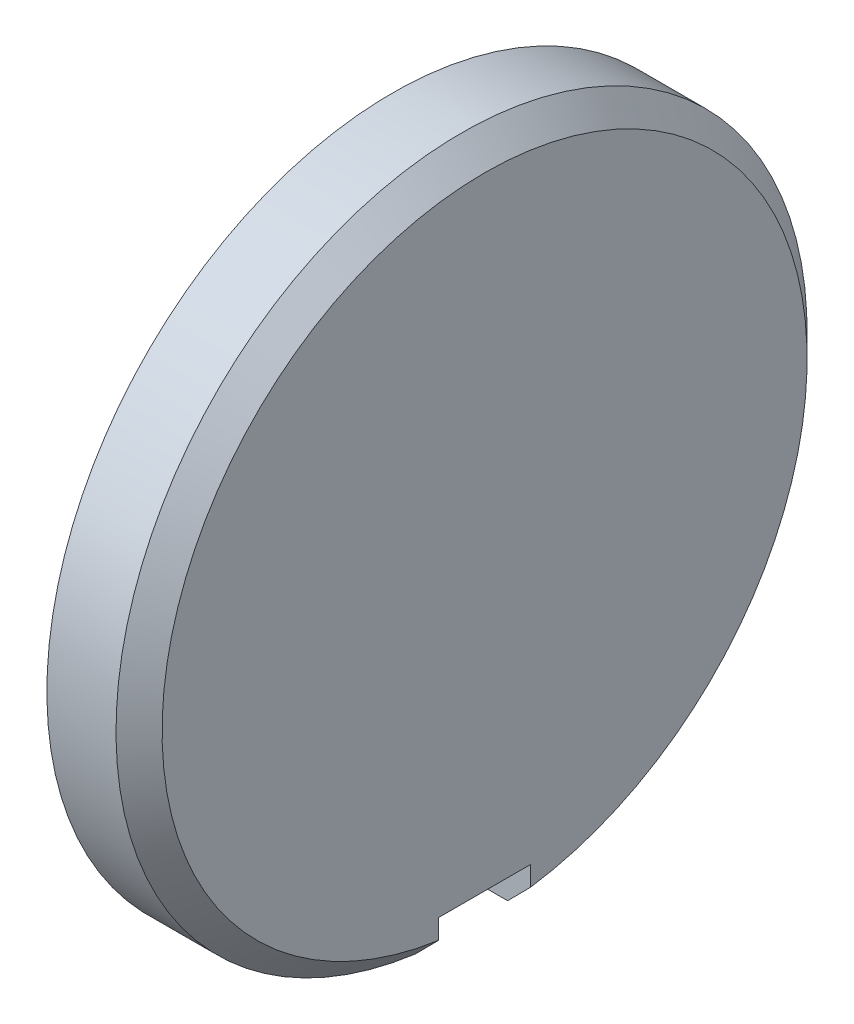
ISO-10303-21;
HEADER;
FILE_DESCRIPTION(('STEP AP214'),'2;1');
FILE_NAME('part.step','',(''),(''),'','','');
FILE_SCHEMA(('AUTOMOTIVE_DESIGN { 1 0 10303 214 1 1 1 1 }'));
ENDSEC;
DATA;
#1=APPLICATION_CONTEXT('core data for automotive mechanical design processes');
#2=APPLICATION_PROTOCOL_DEFINITION('international standard','automotive_design',2000,#1);
#3=PRODUCT_CONTEXT('',#1,'mechanical');
#4=PRODUCT('Part','Part','',(#3));
#5=PRODUCT_RELATED_PRODUCT_CATEGORY('part','',(#4));
#6=PRODUCT_DEFINITION_FORMATION('','',#4);
#7=PRODUCT_DEFINITION_CONTEXT('part definition',#1,'design');
#8=PRODUCT_DEFINITION('design','',#6,#7);
#9=PRODUCT_DEFINITION_SHAPE('','',#8);
#10=(LENGTH_UNIT() NAMED_UNIT(*) SI_UNIT(.MILLI.,.METRE.));
#11=(NAMED_UNIT(*) PLANE_ANGLE_UNIT() SI_UNIT($,.RADIAN.));
#12=(NAMED_UNIT(*) SI_UNIT($,.STERADIAN.) SOLID_ANGLE_UNIT());
#13=UNCERTAINTY_MEASURE_WITH_UNIT(LENGTH_MEASURE(1.E-05),#10,'distance_accuracy_value','');
#14=(GEOMETRIC_REPRESENTATION_CONTEXT(3) GLOBAL_UNCERTAINTY_ASSIGNED_CONTEXT((#13)) GLOBAL_UNIT_ASSIGNED_CONTEXT((#10,
#11,#12)) REPRESENTATION_CONTEXT('',''));
#15=CARTESIAN_POINT('',(0.,0.,0.));
#16=DIRECTION('',(0.,0.,1.));
#17=DIRECTION('',(1.,0.,0.));
#18=AXIS2_PLACEMENT_3D('',#15,#16,#17);
#19=CARTESIAN_POINT('',(61.,18.,-52.));
#20=DIRECTION('',(-1.,0.,0.));
#21=DIRECTION('',(0.,0.,1.));
#22=AXIS2_PLACEMENT_3D('',#19,#20,#21);
#23=PLANE('',#22);
#24=DIRECTION('',(0.,-1.,0.));
#25=VECTOR('',#24,1.);
#26=CARTESIAN_POINT('',(61.,18.,-51.2));
#27=LINE('',#26,#25);
#28=CARTESIAN_POINT('',(61.,12.8,-51.2));
#29=VERTEX_POINT('',#28);
#30=CARTESIAN_POINT('',(61.,12.4574374157796,-51.2));
#31=VERTEX_POINT('',#30);
#32=EDGE_CURVE('E210',#29,#31,#27,.T.);
#33=ORIENTED_EDGE('',*,*,#32,.F.);
#34=DIRECTION('',(0.,0.,1.));
#35=VECTOR('',#34,1.);
#36=CARTESIAN_POINT('',(61.,12.8,-52.));
#37=LINE('',#36,#35);
#38=CARTESIAN_POINT('',(61.,12.8,-52.8));
#39=VERTEX_POINT('',#38);
#40=EDGE_CURVE('E202',#39,#29,#37,.T.);
#41=ORIENTED_EDGE('',*,*,#40,.F.);
#42=DIRECTION('',(0.,-1.,0.));
#43=VECTOR('',#42,1.);
#44=CARTESIAN_POINT('',(61.,18.,-52.8));
#45=LINE('',#44,#43);
#46=CARTESIAN_POINT('',(61.,12.4574374157796,-52.8));
#47=VERTEX_POINT('',#46);
#48=EDGE_CURVE('E188',#39,#47,#45,.T.);
#49=ORIENTED_EDGE('',*,*,#48,.T.);
#50=CARTESIAN_POINT('',(61.,18.,-52.));
#51=DIRECTION('',(-1.,0.,0.));
#52=DIRECTION('',(0.,0.,1.));
#53=AXIS2_PLACEMENT_3D('',#50,#51,#52);
#54=CIRCLE('',#53,5.6);
#55=EDGE_CURVE('E315',#31,#47,#54,.T.);
#56=ORIENTED_EDGE('',*,*,#55,.F.);
#57=EDGE_LOOP('',(#33,#41,#49,#56));
#58=FACE_BOUND('',#57,.T.);
#59=ADVANCED_FACE('F47',(#58),#23,.F.);
#60=CARTESIAN_POINT('',(61.,18.,-52.));
#61=DIRECTION('',(-1.,0.,0.));
#62=DIRECTION('',(0.,0.,1.));
#63=AXIS2_PLACEMENT_3D('',#60,#61,#62);
#64=CONICAL_SURFACE('',#63,5.6,0.785398163397448);
#65=CARTESIAN_POINT('',(61.8946271909999,13.3631332484449,-51.2));
#66=CARTESIAN_POINT('',(61.7126166868986,13.1784446629332,-51.2));
#67=CARTESIAN_POINT('',(61.5304582431577,12.9939020574378,-51.2));
#68=CARTESIAN_POINT('',(61.1659108831408,12.625044935687,-51.2));
#69=CARTESIAN_POINT('',(60.9835219670776,12.4407304192213,-51.2));
#70=CARTESIAN_POINT('',(60.6185788185969,12.0722653505341,-51.2));
#71=CARTESIAN_POINT('',(60.4360245862569,11.8881147982359,-51.2));
#72=CARTESIAN_POINT('',(60.0707866928955,11.5199417495671,-51.2));
#73=CARTESIAN_POINT('',(59.8881030317565,11.3359192533132,-51.2));
#74=CARTESIAN_POINT('',(59.7053728090001,11.151943041791,-51.2));
#75=B_SPLINE_CURVE_WITH_KNOTS('',3,(#65,#66,#67,#68,#69,#70,#71,#72,#73,#74),.UNSPECIFIED.,.F.,
.F.,(4,2,2,2,4),(0.,0.777906711944208,1.5558127061892,2.3337183358319,3.11162467374071),.UNSPECIFIED.);
#76=CARTESIAN_POINT('',(60.6,12.0535725010726,-51.2));
#77=VERTEX_POINT('',#76);
#78=EDGE_CURVE('E217',#31,#77,#75,.T.);
#79=ORIENTED_EDGE('',*,*,#78,.F.);
#80=ORIENTED_EDGE('',*,*,#55,.T.);
#81=CARTESIAN_POINT('',(61.8946271909999,13.3631332484449,-52.8));
#82=CARTESIAN_POINT('',(61.7126166868986,13.1784446629332,-52.8));
#83=CARTESIAN_POINT('',(61.5304582431577,12.9939020574378,-52.8));
#84=CARTESIAN_POINT('',(61.1659108831408,12.625044935687,-52.8));
#85=CARTESIAN_POINT('',(60.9835219670776,12.4407304192213,-52.8));
#86=CARTESIAN_POINT('',(60.6185788185969,12.0722653505341,-52.8));
#87=CARTESIAN_POINT('',(60.4360245862569,11.8881147982359,-52.8));
#88=CARTESIAN_POINT('',(60.0707866928955,11.5199417495671,-52.8));
#89=CARTESIAN_POINT('',(59.8881030317565,11.3359192533132,-52.8));
#90=CARTESIAN_POINT('',(59.7053728090001,11.151943041791,-52.8));
#91=B_SPLINE_CURVE_WITH_KNOTS('',3,(#81,#82,#83,#84,#85,#86,#87,#88,#89,#90),.UNSPECIFIED.,.F.,
.F.,(4,2,2,2,4),(0.,0.777906711944208,1.5558127061892,2.3337183358319,3.11162467374071),.UNSPECIFIED.);
#92=CARTESIAN_POINT('',(60.6,12.0535725010726,-52.8));
#93=VERTEX_POINT('',#92);
#94=EDGE_CURVE('E191',#47,#93,#91,.T.);
#95=ORIENTED_EDGE('',*,*,#94,.T.);
#96=CARTESIAN_POINT('',(60.6,18.,-52.));
#97=DIRECTION('',(-1.,0.,0.));
#98=DIRECTION('',(0.,0.,1.));
#99=AXIS2_PLACEMENT_3D('',#96,#97,#98);
#100=CIRCLE('',#99,6.);
#101=EDGE_CURVE('E311',#77,#93,#100,.T.);
#102=ORIENTED_EDGE('',*,*,#101,.F.);
#103=EDGE_LOOP('',(#79,#80,#95,#102));
#104=FACE_BOUND('',#103,.T.);
#105=ADVANCED_FACE('F470',(#104),#64,.T.);
#106=CARTESIAN_POINT('',(53.2,18.,-52.));
#107=DIRECTION('',(-1.,0.,0.));
#108=DIRECTION('',(0.,0.,1.));
#109=AXIS2_PLACEMENT_3D('',#106,#107,#108);
#110=CYLINDRICAL_SURFACE('',#109,6.);
#111=DIRECTION('',(-1.,0.,0.));
#112=VECTOR('',#111,1.);
#113=CARTESIAN_POINT('',(53.2,12.0535725010726,-51.2));
#114=LINE('',#113,#112);
#115=CARTESIAN_POINT('',(59.4,12.0535725010726,-51.2));
#116=VERTEX_POINT('',#115);
#117=EDGE_CURVE('E197',#77,#116,#114,.T.);
#118=ORIENTED_EDGE('',*,*,#117,.F.);
#119=ORIENTED_EDGE('',*,*,#101,.T.);
#120=DIRECTION('',(-1.,0.,0.));
#121=VECTOR('',#120,1.);
#122=CARTESIAN_POINT('',(53.2,12.0535725010726,-52.8));
#123=LINE('',#122,#121);
#124=CARTESIAN_POINT('',(59.4,12.0535725010726,-52.8));
#125=VERTEX_POINT('',#124);
#126=EDGE_CURVE('E679',#93,#125,#123,.T.);
#127=ORIENTED_EDGE('',*,*,#126,.T.);
#128=CARTESIAN_POINT('',(59.4,18.,-52.));
#129=DIRECTION('',(-1.,0.,0.));
#130=DIRECTION('',(0.,0.,1.));
#131=AXIS2_PLACEMENT_3D('',#128,#129,#130);
#132=CIRCLE('',#131,6.);
#133=EDGE_CURVE('E307',#116,#125,#132,.T.);
#134=ORIENTED_EDGE('',*,*,#133,.F.);
#135=EDGE_LOOP('',(#118,#119,#127,#134));
#136=FACE_BOUND('',#135,.T.);
#137=ADVANCED_FACE('F475',(#136),#110,.T.);
#138=CARTESIAN_POINT('',(59.4,24.,-52.));
#139=DIRECTION('',(1.,0.,0.));
#140=DIRECTION('',(0.,0.,-1.));
#141=AXIS2_PLACEMENT_3D('',#138,#139,#140);
#142=PLANE('',#141);
#143=CARTESIAN_POINT('',(59.4,18.,-52.));
#144=DIRECTION('',(-1.,0.,0.));
#145=DIRECTION('',(0.,0.,1.));
#146=AXIS2_PLACEMENT_3D('',#143,#144,#145);
#147=CIRCLE('',#146,3.);
#148=CARTESIAN_POINT('',(59.4,18.,-49.));
#149=VERTEX_POINT('',#148);
#150=EDGE_CURVE('E301',#149,#149,#147,.T.);
#151=ORIENTED_EDGE('',*,*,#150,.F.);
#152=EDGE_LOOP('',(#151));
#153=FACE_BOUND('',#152,.T.);
#154=DIRECTION('',(0.,1.,0.));
#155=VECTOR('',#154,1.);
#156=CARTESIAN_POINT('',(59.4,24.,-51.2));
#157=LINE('',#156,#155);
#158=CARTESIAN_POINT('',(59.4,12.8,-51.2));
#159=VERTEX_POINT('',#158);
#160=EDGE_CURVE('E11',#116,#159,#157,.T.);
#161=ORIENTED_EDGE('',*,*,#160,.F.);
#162=ORIENTED_EDGE('',*,*,#133,.T.);
#163=DIRECTION('',(0.,1.,0.));
#164=VECTOR('',#163,1.);
#165=CARTESIAN_POINT('',(59.4,24.,-52.8));
#166=LINE('',#165,#164);
#167=CARTESIAN_POINT('',(59.4,12.8,-52.8));
#168=VERTEX_POINT('',#167);
#169=EDGE_CURVE('E363',#125,#168,#166,.T.);
#170=ORIENTED_EDGE('',*,*,#169,.T.);
#171=DIRECTION('',(0.,0.,-1.));
#172=VECTOR('',#171,1.);
#173=CARTESIAN_POINT('',(59.4,12.8,-52.));
#174=LINE('',#173,#172);
#175=EDGE_CURVE('E56',#159,#168,#174,.T.);
#176=ORIENTED_EDGE('',*,*,#175,.F.);
#177=EDGE_LOOP('',(#161,#162,#170,#176));
#178=FACE_BOUND('',#177,.T.);
#179=ADVANCED_FACE('F498',(#153,#178),#142,.F.);
#180=CARTESIAN_POINT('',(58.2,21.,-52.));
#181=DIRECTION('',(1.,0.,0.));
#182=DIRECTION('',(0.,0.,-1.));
#183=AXIS2_PLACEMENT_3D('',#180,#181,#182);
#184=PLANE('',#183);
#185=DIRECTION('',(0.,1.,0.));
#186=VECTOR('',#185,1.);
#187=CARTESIAN_POINT('',(58.2,21.,-51.6));
#188=LINE('',#187,#186);
#189=CARTESIAN_POINT('',(58.2,15.0267862505363,-51.6));
#190=VERTEX_POINT('',#189);
#191=CARTESIAN_POINT('',(58.2,15.7350496694188,-51.6));
#192=VERTEX_POINT('',#191);
#193=EDGE_CURVE('E248',#190,#192,#188,.T.);
#194=ORIENTED_EDGE('',*,*,#193,.F.);
#195=CARTESIAN_POINT('',(58.2,18.,-52.));
#196=DIRECTION('',(-1.,0.,0.));
#197=DIRECTION('',(0.,0.,1.));
#198=AXIS2_PLACEMENT_3D('',#195,#196,#197);
#199=CIRCLE('',#198,3.);
#200=CARTESIAN_POINT('',(58.2,17.6,-49.0267862505363));
#201=VERTEX_POINT('',#200);
#202=EDGE_CURVE('E296',#190,#201,#199,.T.);
#203=ORIENTED_EDGE('',*,*,#202,.T.);
#204=DIRECTION('',(0.,0.,1.));
#205=VECTOR('',#204,1.);
#206=CARTESIAN_POINT('',(58.2,17.6,-52.));
#207=LINE('',#206,#205);
#208=CARTESIAN_POINT('',(58.2,17.6,-49.7350496694188));
#209=VERTEX_POINT('',#208);
#210=EDGE_CURVE('E284',#209,#201,#207,.T.);
#211=ORIENTED_EDGE('',*,*,#210,.F.);
#212=CARTESIAN_POINT('',(58.2,18.,-52.));
#213=DIRECTION('',(-1.,0.,0.));
#214=DIRECTION('',(0.,0.,1.));
#215=AXIS2_PLACEMENT_3D('',#212,#213,#214);
#216=CIRCLE('',#215,2.3);
#217=EDGE_CURVE('E322',#192,#209,#216,.T.);
#218=ORIENTED_EDGE('',*,*,#217,.F.);
#219=EDGE_LOOP('',(#194,#203,#211,#218));
#220=FACE_BOUND('',#219,.T.);
#221=ADVANCED_FACE('F418',(#220),#184,.F.);
#222=DIRECTION('',(0.,1.,0.));
#223=VECTOR('',#222,1.);
#224=CARTESIAN_POINT('',(58.2,21.,-51.6));
#225=LINE('',#224,#223);
#226=CARTESIAN_POINT('',(58.2,20.2649503305812,-51.6));
#227=VERTEX_POINT('',#226);
#228=CARTESIAN_POINT('',(58.2,20.9732137494637,-51.6));
#229=VERTEX_POINT('',#228);
#230=EDGE_CURVE('E242',#227,#229,#225,.T.);
#231=ORIENTED_EDGE('',*,*,#230,.F.);
#232=CARTESIAN_POINT('',(58.2,18.4,-49.7350496694188));
#233=VERTEX_POINT('',#232);
#234=EDGE_CURVE('E323',#233,#227,#216,.T.);
#235=ORIENTED_EDGE('',*,*,#234,.F.);
#236=DIRECTION('',(0.,0.,-1.));
#237=VECTOR('',#236,1.);
#238=CARTESIAN_POINT('',(58.2,18.4,-52.));
#239=LINE('',#238,#237);
#240=CARTESIAN_POINT('',(58.2,18.4,-49.0267862505363));
#241=VERTEX_POINT('',#240);
#242=EDGE_CURVE('E273',#241,#233,#239,.T.);
#243=ORIENTED_EDGE('',*,*,#242,.F.);
#244=EDGE_CURVE('E297',#241,#229,#199,.T.);
#245=ORIENTED_EDGE('',*,*,#244,.T.);
#246=EDGE_LOOP('',(#231,#235,#243,#245));
#247=FACE_BOUND('',#246,.T.);
#248=ADVANCED_FACE('F436',(#247),#184,.F.);
#249=CARTESIAN_POINT('',(53.2,18.,-52.));
#250=DIRECTION('',(-1.,0.,0.));
#251=DIRECTION('',(0.,0.,1.));
#252=AXIS2_PLACEMENT_3D('',#249,#250,#251);
#253=CYLINDRICAL_SURFACE('',#252,2.3);
#254=CARTESIAN_POINT('',(59.4,18.,-52.));
#255=DIRECTION('',(-1.,0.,0.));
#256=DIRECTION('',(0.,0.,1.));
#257=AXIS2_PLACEMENT_3D('',#254,#255,#256);
#258=CIRCLE('',#257,2.3);
#259=CARTESIAN_POINT('',(59.4,18.,-49.7));
#260=VERTEX_POINT('',#259);
#261=EDGE_CURVE('E318',#260,#260,#258,.T.);
#262=ORIENTED_EDGE('',*,*,#261,.F.);
#263=EDGE_LOOP('',(#262));
#264=FACE_BOUND('',#263,.T.);
#265=DIRECTION('',(-1.,0.,0.));
#266=VECTOR('',#265,1.);
#267=CARTESIAN_POINT('',(53.2,15.7350496694188,-51.6));
#268=LINE('',#267,#266);
#269=CARTESIAN_POINT('',(59.38,15.7350496694188,-51.6));
#270=VERTEX_POINT('',#269);
#271=EDGE_CURVE('E251',#192,#270,#268,.F.);
#272=ORIENTED_EDGE('',*,*,#271,.F.);
#273=ORIENTED_EDGE('',*,*,#217,.T.);
#274=DIRECTION('',(-1.,0.,0.));
#275=VECTOR('',#274,1.);
#276=CARTESIAN_POINT('',(53.2,17.6,-49.7350496694188));
#277=LINE('',#276,#275);
#278=CARTESIAN_POINT('',(59.38,17.6,-49.7350496694188));
#279=VERTEX_POINT('',#278);
#280=EDGE_CURVE('E288',#279,#209,#277,.T.);
#281=ORIENTED_EDGE('',*,*,#280,.F.);
#282=CARTESIAN_POINT('',(59.38,18.,-52.));
#283=DIRECTION('',(-1.,0.,0.));
#284=DIRECTION('',(0.,0.,1.));
#285=AXIS2_PLACEMENT_3D('',#282,#283,#284);
#286=CIRCLE('',#285,2.3);
#287=CARTESIAN_POINT('',(59.38,18.4,-49.7350496694188));
#288=VERTEX_POINT('',#287);
#289=EDGE_CURVE('E280',#288,#279,#286,.F.);
#290=ORIENTED_EDGE('',*,*,#289,.F.);
#291=DIRECTION('',(-1.,0.,0.));
#292=VECTOR('',#291,1.);
#293=CARTESIAN_POINT('',(53.2,18.4,-49.7350496694188));
#294=LINE('',#293,#292);
#295=EDGE_CURVE('E277',#233,#288,#294,.F.);
#296=ORIENTED_EDGE('',*,*,#295,.F.);
#297=ORIENTED_EDGE('',*,*,#234,.T.);
#298=DIRECTION('',(-1.,0.,0.));
#299=VECTOR('',#298,1.);
#300=CARTESIAN_POINT('',(53.2,20.2649503305812,-51.6));
#301=LINE('',#300,#299);
#302=CARTESIAN_POINT('',(59.38,20.2649503305812,-51.6));
#303=VERTEX_POINT('',#302);
#304=EDGE_CURVE('E245',#303,#227,#301,.T.);
#305=ORIENTED_EDGE('',*,*,#304,.F.);
#306=CARTESIAN_POINT('',(59.38,18.,-52.));
#307=DIRECTION('',(-1.,0.,0.));
#308=DIRECTION('',(0.,0.,1.));
#309=AXIS2_PLACEMENT_3D('',#306,#307,#308);
#310=CIRCLE('',#309,2.3);
#311=CARTESIAN_POINT('',(59.38,20.2649503305812,-52.4));
#312=VERTEX_POINT('',#311);
#313=EDGE_CURVE('E254',#312,#303,#310,.F.);
#314=ORIENTED_EDGE('',*,*,#313,.F.);
#315=DIRECTION('',(-1.,0.,0.));
#316=VECTOR('',#315,1.);
#317=CARTESIAN_POINT('',(53.2,20.2649503305812,-52.4));
#318=LINE('',#317,#316);
#319=CARTESIAN_POINT('',(58.2,20.2649503305812,-52.4));
#320=VERTEX_POINT('',#319);
#321=EDGE_CURVE('E230',#312,#320,#318,.T.);
#322=ORIENTED_EDGE('',*,*,#321,.T.);
#323=CARTESIAN_POINT('',(58.2,18.4,-54.2649503305812));
#324=VERTEX_POINT('',#323);
#325=EDGE_CURVE('E328',#320,#324,#216,.T.);
#326=ORIENTED_EDGE('',*,*,#325,.T.);
#327=DIRECTION('',(-1.,0.,0.));
#328=VECTOR('',#327,1.);
#329=CARTESIAN_POINT('',(53.2,18.4,-54.2649503305812));
#330=LINE('',#329,#328);
#331=CARTESIAN_POINT('',(59.38,18.4,-54.2649503305812));
#332=VERTEX_POINT('',#331);
#333=EDGE_CURVE('E272',#332,#324,#330,.T.);
#334=ORIENTED_EDGE('',*,*,#333,.F.);
#335=CARTESIAN_POINT('',(59.38,17.6,-54.2649503305812));
#336=VERTEX_POINT('',#335);
#337=EDGE_CURVE('E283',#336,#332,#286,.F.);
#338=ORIENTED_EDGE('',*,*,#337,.F.);
#339=DIRECTION('',(-1.,0.,0.));
#340=VECTOR('',#339,1.);
#341=CARTESIAN_POINT('',(53.2,17.6,-54.2649503305812));
#342=LINE('',#341,#340);
#343=CARTESIAN_POINT('',(58.2,17.6,-54.2649503305812));
#344=VERTEX_POINT('',#343);
#345=EDGE_CURVE('E293',#344,#336,#342,.F.);
#346=ORIENTED_EDGE('',*,*,#345,.F.);
#347=CARTESIAN_POINT('',(58.2,15.7350496694188,-52.4));
#348=VERTEX_POINT('',#347);
#349=EDGE_CURVE('E329',#344,#348,#216,.T.);
#350=ORIENTED_EDGE('',*,*,#349,.T.);
#351=DIRECTION('',(-1.,0.,0.));
#352=VECTOR('',#351,1.);
#353=CARTESIAN_POINT('',(53.2,15.7350496694188,-52.4));
#354=LINE('',#353,#352);
#355=CARTESIAN_POINT('',(59.38,15.7350496694188,-52.4));
#356=VERTEX_POINT('',#355);
#357=EDGE_CURVE('E238',#348,#356,#354,.F.);
#358=ORIENTED_EDGE('',*,*,#357,.T.);
#359=EDGE_CURVE('E257',#270,#356,#310,.F.);
#360=ORIENTED_EDGE('',*,*,#359,.F.);
#361=EDGE_LOOP('',(#272,#273,#281,#290,#296,#297,#305,#314,#322,#326,#334,#338,#346,#350,#358,#360));
#362=FACE_BOUND('',#361,.T.);
#363=ADVANCED_FACE('F397',(#264,#362),#253,.F.);
#364=CARTESIAN_POINT('',(53.2,18.,-52.));
#365=DIRECTION('',(-1.,0.,0.));
#366=DIRECTION('',(0.,0.,1.));
#367=AXIS2_PLACEMENT_3D('',#364,#365,#366);
#368=CYLINDRICAL_SURFACE('',#367,3.);
#369=ORIENTED_EDGE('',*,*,#150,.T.);
#370=EDGE_LOOP('',(#369));
#371=FACE_BOUND('',#370,.T.);
#372=DIRECTION('',(-1.,0.,0.));
#373=VECTOR('',#372,1.);
#374=CARTESIAN_POINT('',(53.2,15.0267862505363,-51.6));
#375=LINE('',#374,#373);
#376=CARTESIAN_POINT('',(59.38,15.0267862505363,-51.6));
#377=VERTEX_POINT('',#376);
#378=EDGE_CURVE('E360',#377,#190,#375,.T.);
#379=ORIENTED_EDGE('',*,*,#378,.F.);
#380=CARTESIAN_POINT('',(59.38,18.,-52.));
#381=DIRECTION('',(-1.,0.,0.));
#382=DIRECTION('',(0.,0.,1.));
#383=AXIS2_PLACEMENT_3D('',#380,#381,#382);
#384=CIRCLE('',#383,3.);
#385=CARTESIAN_POINT('',(59.38,15.0267862505363,-52.4));
#386=VERTEX_POINT('',#385);
#387=EDGE_CURVE('E353',#386,#377,#384,.T.);
#388=ORIENTED_EDGE('',*,*,#387,.F.);
#389=DIRECTION('',(-1.,0.,0.));
#390=VECTOR('',#389,1.);
#391=CARTESIAN_POINT('',(53.2,15.0267862505363,-52.4));
#392=LINE('',#391,#390);
#393=CARTESIAN_POINT('',(58.2,15.0267862505363,-52.4));
#394=VERTEX_POINT('',#393);
#395=EDGE_CURVE('E356',#386,#394,#392,.T.);
#396=ORIENTED_EDGE('',*,*,#395,.T.);
#397=CARTESIAN_POINT('',(58.2,17.6,-54.9732137494637));
#398=VERTEX_POINT('',#397);
#399=EDGE_CURVE('E303',#398,#394,#199,.T.);
#400=ORIENTED_EDGE('',*,*,#399,.F.);
#401=DIRECTION('',(-1.,0.,0.));
#402=VECTOR('',#401,1.);
#403=CARTESIAN_POINT('',(53.2,17.6,-54.9732137494637));
#404=LINE('',#403,#402);
#405=CARTESIAN_POINT('',(59.38,17.6,-54.9732137494637));
#406=VERTEX_POINT('',#405);
#407=EDGE_CURVE('E335',#406,#398,#404,.T.);
#408=ORIENTED_EDGE('',*,*,#407,.F.);
#409=CARTESIAN_POINT('',(59.38,18.,-52.));
#410=DIRECTION('',(-1.,0.,0.));
#411=DIRECTION('',(0.,0.,1.));
#412=AXIS2_PLACEMENT_3D('',#409,#410,#411);
#413=CIRCLE('',#412,3.);
#414=CARTESIAN_POINT('',(59.38,18.4,-54.9732137494637));
#415=VERTEX_POINT('',#414);
#416=EDGE_CURVE('E332',#415,#406,#413,.T.);
#417=ORIENTED_EDGE('',*,*,#416,.F.);
#418=DIRECTION('',(-1.,0.,0.));
#419=VECTOR('',#418,1.);
#420=CARTESIAN_POINT('',(53.2,18.4,-54.9732137494637));
#421=LINE('',#420,#419);
#422=CARTESIAN_POINT('',(58.2,18.4,-54.9732137494637));
#423=VERTEX_POINT('',#422);
#424=EDGE_CURVE('E327',#423,#415,#421,.F.);
#425=ORIENTED_EDGE('',*,*,#424,.F.);
#426=CARTESIAN_POINT('',(58.2,20.9732137494637,-52.4));
#427=VERTEX_POINT('',#426);
#428=EDGE_CURVE('E302',#427,#423,#199,.T.);
#429=ORIENTED_EDGE('',*,*,#428,.F.);
#430=DIRECTION('',(-1.,0.,0.));
#431=VECTOR('',#430,1.);
#432=CARTESIAN_POINT('',(53.2,20.9732137494637,-52.4));
#433=LINE('',#432,#431);
#434=CARTESIAN_POINT('',(59.38,20.9732137494637,-52.4));
#435=VERTEX_POINT('',#434);
#436=EDGE_CURVE('E345',#427,#435,#433,.F.);
#437=ORIENTED_EDGE('',*,*,#436,.T.);
#438=CARTESIAN_POINT('',(59.38,20.9732137494637,-51.6));
#439=VERTEX_POINT('',#438);
#440=EDGE_CURVE('E349',#439,#435,#384,.T.);
#441=ORIENTED_EDGE('',*,*,#440,.F.);
#442=DIRECTION('',(-1.,0.,0.));
#443=VECTOR('',#442,1.);
#444=CARTESIAN_POINT('',(53.2,20.9732137494637,-51.6));
#445=LINE('',#444,#443);
#446=EDGE_CURVE('E352',#229,#439,#445,.F.);
#447=ORIENTED_EDGE('',*,*,#446,.F.);
#448=ORIENTED_EDGE('',*,*,#244,.F.);
#449=DIRECTION('',(-1.,0.,0.));
#450=VECTOR('',#449,1.);
#451=CARTESIAN_POINT('',(53.2,18.4,-49.0267862505363));
#452=LINE('',#451,#450);
#453=CARTESIAN_POINT('',(59.38,18.4,-49.0267862505363));
#454=VERTEX_POINT('',#453);
#455=EDGE_CURVE('E339',#454,#241,#452,.T.);
#456=ORIENTED_EDGE('',*,*,#455,.F.);
#457=CARTESIAN_POINT('',(59.38,17.6,-49.0267862505363));
#458=VERTEX_POINT('',#457);
#459=EDGE_CURVE('E336',#458,#454,#413,.T.);
#460=ORIENTED_EDGE('',*,*,#459,.F.);
#461=DIRECTION('',(-1.,0.,0.));
#462=VECTOR('',#461,1.);
#463=CARTESIAN_POINT('',(53.2,17.6,-49.0267862505363));
#464=LINE('',#463,#462);
#465=EDGE_CURVE('E342',#201,#458,#464,.F.);
#466=ORIENTED_EDGE('',*,*,#465,.F.);
#467=ORIENTED_EDGE('',*,*,#202,.F.);
#468=EDGE_LOOP('',(#379,#388,#396,#400,#408,#417,#425,#429,#437,#441,#447,#448,#456,#460,#466,#467));
#469=FACE_BOUND('',#468,.T.);
#470=ADVANCED_FACE('F406',(#371,#469),#368,.T.);
#471=ORIENTED_EDGE('',*,*,#399,.T.);
#472=DIRECTION('',(0.,1.,0.));
#473=VECTOR('',#472,1.);
#474=CARTESIAN_POINT('',(58.2,21.,-52.4));
#475=LINE('',#474,#473);
#476=EDGE_CURVE('E234',#394,#348,#475,.T.);
#477=ORIENTED_EDGE('',*,*,#476,.T.);
#478=ORIENTED_EDGE('',*,*,#349,.F.);
#479=EDGE_CURVE('E289',#398,#344,#207,.T.);
#480=ORIENTED_EDGE('',*,*,#479,.F.);
#481=EDGE_LOOP('',(#471,#477,#478,#480));
#482=FACE_BOUND('',#481,.T.);
#483=ADVANCED_FACE('F49',(#482),#184,.F.);
#484=ORIENTED_EDGE('',*,*,#325,.F.);
#485=DIRECTION('',(0.,1.,0.));
#486=VECTOR('',#485,1.);
#487=CARTESIAN_POINT('',(58.2,21.,-52.4));
#488=LINE('',#487,#486);
#489=EDGE_CURVE('E226',#320,#427,#488,.T.);
#490=ORIENTED_EDGE('',*,*,#489,.T.);
#491=ORIENTED_EDGE('',*,*,#428,.T.);
#492=EDGE_CURVE('E268',#324,#423,#239,.T.);
#493=ORIENTED_EDGE('',*,*,#492,.F.);
#494=EDGE_LOOP('',(#484,#490,#491,#493));
#495=FACE_BOUND('',#494,.T.);
#496=ADVANCED_FACE('F450',(#495),#184,.F.);
#497=CARTESIAN_POINT('',(59.4,20.3,-52.));
#498=DIRECTION('',(1.,0.,0.));
#499=DIRECTION('',(0.,0.,-1.));
#500=AXIS2_PLACEMENT_3D('',#497,#498,#499);
#501=PLANE('',#500);
#502=ORIENTED_EDGE('',*,*,#261,.T.);
#503=EDGE_LOOP('',(#502));
#504=FACE_BOUND('',#503,.T.);
#505=ADVANCED_FACE('F481',(#504),#501,.F.);
#506=CARTESIAN_POINT('',(58.1,18.4,-48.8));
#507=DIRECTION('',(0.,-1.,0.));
#508=DIRECTION('',(0.,0.,-1.));
#509=AXIS2_PLACEMENT_3D('',#506,#507,#508);
#510=PLANE('',#509);
#511=ORIENTED_EDGE('',*,*,#333,.T.);
#512=ORIENTED_EDGE('',*,*,#492,.T.);
#513=ORIENTED_EDGE('',*,*,#424,.T.);
#514=DIRECTION('',(0.,0.,-1.));
#515=VECTOR('',#514,1.);
#516=CARTESIAN_POINT('',(59.38,18.4,-48.8));
#517=LINE('',#516,#515);
#518=EDGE_CURVE('E258',#332,#415,#517,.T.);
#519=ORIENTED_EDGE('',*,*,#518,.F.);
#520=EDGE_LOOP('',(#511,#512,#513,#519));
#521=FACE_BOUND('',#520,.T.);
#522=ADVANCED_FACE('F453',(#521),#510,.T.);
#523=CARTESIAN_POINT('',(59.38,17.6,-48.8));
#524=DIRECTION('',(-1.,0.,0.));
#525=DIRECTION('',(0.,0.,1.));
#526=AXIS2_PLACEMENT_3D('',#523,#524,#525);
#527=PLANE('',#526);
#528=ORIENTED_EDGE('',*,*,#337,.T.);
#529=ORIENTED_EDGE('',*,*,#518,.T.);
#530=ORIENTED_EDGE('',*,*,#416,.T.);
#531=DIRECTION('',(0.,0.,-1.));
#532=VECTOR('',#531,1.);
#533=CARTESIAN_POINT('',(59.38,17.6,-48.8));
#534=LINE('',#533,#532);
#535=EDGE_CURVE('E263',#336,#406,#534,.T.);
#536=ORIENTED_EDGE('',*,*,#535,.F.);
#537=EDGE_LOOP('',(#528,#529,#530,#536));
#538=FACE_BOUND('',#537,.T.);
#539=ADVANCED_FACE('F458',(#538),#527,.T.);
#540=CARTESIAN_POINT('',(58.1,17.6,-48.8));
#541=DIRECTION('',(0.,1.,0.));
#542=DIRECTION('',(0.,0.,1.));
#543=AXIS2_PLACEMENT_3D('',#540,#541,#542);
#544=PLANE('',#543);
#545=ORIENTED_EDGE('',*,*,#345,.T.);
#546=ORIENTED_EDGE('',*,*,#535,.T.);
#547=ORIENTED_EDGE('',*,*,#407,.T.);
#548=ORIENTED_EDGE('',*,*,#479,.T.);
#549=EDGE_LOOP('',(#545,#546,#547,#548));
#550=FACE_BOUND('',#549,.T.);
#551=ADVANCED_FACE('F460',(#550),#544,.T.);
#552=ORIENTED_EDGE('',*,*,#280,.T.);
#553=ORIENTED_EDGE('',*,*,#210,.T.);
#554=ORIENTED_EDGE('',*,*,#465,.T.);
#555=EDGE_CURVE('E267',#458,#279,#534,.T.);
#556=ORIENTED_EDGE('',*,*,#555,.T.);
#557=EDGE_LOOP('',(#552,#553,#554,#556));
#558=FACE_BOUND('',#557,.T.);
#559=ADVANCED_FACE('F421',(#558),#544,.T.);
#560=ORIENTED_EDGE('',*,*,#289,.T.);
#561=ORIENTED_EDGE('',*,*,#555,.F.);
#562=ORIENTED_EDGE('',*,*,#459,.T.);
#563=EDGE_CURVE('E262',#454,#288,#517,.T.);
#564=ORIENTED_EDGE('',*,*,#563,.T.);
#565=EDGE_LOOP('',(#560,#561,#562,#564));
#566=FACE_BOUND('',#565,.T.);
#567=ADVANCED_FACE('F427',(#566),#527,.T.);
#568=ORIENTED_EDGE('',*,*,#295,.T.);
#569=ORIENTED_EDGE('',*,*,#563,.F.);
#570=ORIENTED_EDGE('',*,*,#455,.T.);
#571=ORIENTED_EDGE('',*,*,#242,.T.);
#572=EDGE_LOOP('',(#568,#569,#570,#571));
#573=FACE_BOUND('',#572,.T.);
#574=ADVANCED_FACE('F539',(#573),#510,.T.);
#575=CARTESIAN_POINT('',(0.,0.,-51.6));
#576=DIRECTION('',(0.,0.,-1.));
#577=DIRECTION('',(-1.,0.,0.));
#578=AXIS2_PLACEMENT_3D('',#575,#576,#577);
#579=PLANE('',#578);
#580=ORIENTED_EDGE('',*,*,#304,.T.);
#581=ORIENTED_EDGE('',*,*,#230,.T.);
#582=ORIENTED_EDGE('',*,*,#446,.T.);
#583=DIRECTION('',(0.,1.,0.));
#584=VECTOR('',#583,1.);
#585=CARTESIAN_POINT('',(59.38,14.8,-51.6));
#586=LINE('',#585,#584);
#587=EDGE_CURVE('E221',#303,#439,#586,.T.);
#588=ORIENTED_EDGE('',*,*,#587,.F.);
#589=EDGE_LOOP('',(#580,#581,#582,#588));
#590=FACE_BOUND('',#589,.T.);
#591=ADVANCED_FACE('F439',(#590),#579,.T.);
#592=CARTESIAN_POINT('',(0.,0.,-52.4));
#593=DIRECTION('',(0.,0.,-1.));
#594=DIRECTION('',(-1.,0.,0.));
#595=AXIS2_PLACEMENT_3D('',#592,#593,#594);
#596=PLANE('',#595);
#597=DIRECTION('',(0.,1.,0.));
#598=VECTOR('',#597,1.);
#599=CARTESIAN_POINT('',(59.38,14.8,-52.4));
#600=LINE('',#599,#598);
#601=EDGE_CURVE('E71',#312,#435,#600,.T.);
#602=ORIENTED_EDGE('',*,*,#601,.T.);
#603=ORIENTED_EDGE('',*,*,#436,.F.);
#604=ORIENTED_EDGE('',*,*,#489,.F.);
#605=ORIENTED_EDGE('',*,*,#321,.F.);
#606=EDGE_LOOP('',(#602,#603,#604,#605));
#607=FACE_BOUND('',#606,.T.);
#608=ADVANCED_FACE('F564',(#607),#596,.F.);
#609=CARTESIAN_POINT('',(59.38,14.8,-51.6));
#610=DIRECTION('',(-1.,0.,0.));
#611=DIRECTION('',(0.,0.,1.));
#612=AXIS2_PLACEMENT_3D('',#609,#610,#611);
#613=PLANE('',#612);
#614=ORIENTED_EDGE('',*,*,#313,.T.);
#615=ORIENTED_EDGE('',*,*,#587,.T.);
#616=ORIENTED_EDGE('',*,*,#440,.T.);
#617=ORIENTED_EDGE('',*,*,#601,.F.);
#618=EDGE_LOOP('',(#614,#615,#616,#617));
#619=FACE_BOUND('',#618,.T.);
#620=ADVANCED_FACE('F444',(#619),#613,.T.);
#621=ORIENTED_EDGE('',*,*,#359,.T.);
#622=EDGE_CURVE('E215',#386,#356,#600,.T.);
#623=ORIENTED_EDGE('',*,*,#622,.F.);
#624=ORIENTED_EDGE('',*,*,#387,.T.);
#625=EDGE_CURVE('E224',#377,#270,#586,.T.);
#626=ORIENTED_EDGE('',*,*,#625,.T.);
#627=EDGE_LOOP('',(#621,#623,#624,#626));
#628=FACE_BOUND('',#627,.T.);
#629=ADVANCED_FACE('F410',(#628),#613,.T.);
#630=ORIENTED_EDGE('',*,*,#271,.T.);
#631=ORIENTED_EDGE('',*,*,#625,.F.);
#632=ORIENTED_EDGE('',*,*,#378,.T.);
#633=ORIENTED_EDGE('',*,*,#193,.T.);
#634=EDGE_LOOP('',(#630,#631,#632,#633));
#635=FACE_BOUND('',#634,.T.);
#636=ADVANCED_FACE('F412',(#635),#579,.T.);
#637=ORIENTED_EDGE('',*,*,#476,.F.);
#638=ORIENTED_EDGE('',*,*,#395,.F.);
#639=ORIENTED_EDGE('',*,*,#622,.T.);
#640=ORIENTED_EDGE('',*,*,#357,.F.);
#641=EDGE_LOOP('',(#637,#638,#639,#640));
#642=FACE_BOUND('',#641,.T.);
#643=ADVANCED_FACE('F391',(#642),#596,.F.);
#644=CARTESIAN_POINT('',(59.3,12.8,-51.2));
#645=DIRECTION('',(0.,-1.,0.));
#646=DIRECTION('',(0.,0.,-1.));
#647=AXIS2_PLACEMENT_3D('',#644,#645,#646);
#648=PLANE('',#647);
#649=ORIENTED_EDGE('',*,*,#40,.T.);
#650=DIRECTION('',(-1.,0.,0.));
#651=VECTOR('',#650,1.);
#652=CARTESIAN_POINT('',(59.3,12.8,-51.2));
#653=LINE('',#652,#651);
#654=EDGE_CURVE('E207',#29,#159,#653,.T.);
#655=ORIENTED_EDGE('',*,*,#654,.T.);
#656=ORIENTED_EDGE('',*,*,#175,.T.);
#657=DIRECTION('',(-1.,0.,0.));
#658=VECTOR('',#657,1.);
#659=CARTESIAN_POINT('',(59.3,12.8,-52.8));
#660=LINE('',#659,#658);
#661=EDGE_CURVE('E63',#39,#168,#660,.T.);
#662=ORIENTED_EDGE('',*,*,#661,.F.);
#663=EDGE_LOOP('',(#649,#655,#656,#662));
#664=FACE_BOUND('',#663,.T.);
#665=ADVANCED_FACE('F200',(#664),#648,.T.);
#666=CARTESIAN_POINT('',(0.,0.,-51.2));
#667=DIRECTION('',(0.,0.,-1.));
#668=DIRECTION('',(-1.,0.,0.));
#669=AXIS2_PLACEMENT_3D('',#666,#667,#668);
#670=PLANE('',#669);
#671=ORIENTED_EDGE('',*,*,#32,.T.);
#672=ORIENTED_EDGE('',*,*,#78,.T.);
#673=ORIENTED_EDGE('',*,*,#117,.T.);
#674=ORIENTED_EDGE('',*,*,#160,.T.);
#675=ORIENTED_EDGE('',*,*,#654,.F.);
#676=EDGE_LOOP('',(#671,#672,#673,#674,#675));
#677=FACE_BOUND('',#676,.T.);
#678=ADVANCED_FACE('F648',(#677),#670,.T.);
#679=CARTESIAN_POINT('',(0.,0.,-52.8));
#680=DIRECTION('',(0.,0.,-1.));
#681=DIRECTION('',(-1.,0.,0.));
#682=AXIS2_PLACEMENT_3D('',#679,#680,#681);
#683=PLANE('',#682);
#684=ORIENTED_EDGE('',*,*,#661,.T.);
#685=ORIENTED_EDGE('',*,*,#169,.F.);
#686=ORIENTED_EDGE('',*,*,#126,.F.);
#687=ORIENTED_EDGE('',*,*,#94,.F.);
#688=ORIENTED_EDGE('',*,*,#48,.F.);
#689=EDGE_LOOP('',(#684,#685,#686,#687,#688));
#690=FACE_BOUND('',#689,.T.);
#691=ADVANCED_FACE('F189',(#690),#683,.F.);
#692=CLOSED_SHELL('',(#59,#105,#137,#179,#221,#248,#363,#470,#483,#496,#505,#522,#539,#551,#559,
#567,#574,#591,#608,#620,#629,#636,#643,#665,#678,#691));
#693=MANIFOLD_SOLID_BREP('B2',#692);
#694=ADVANCED_BREP_SHAPE_REPRESENTATION('',(#18,#693),#14);
#695=SHAPE_DEFINITION_REPRESENTATION(#9,#694);
ENDSEC;
END-ISO-10303-21;
